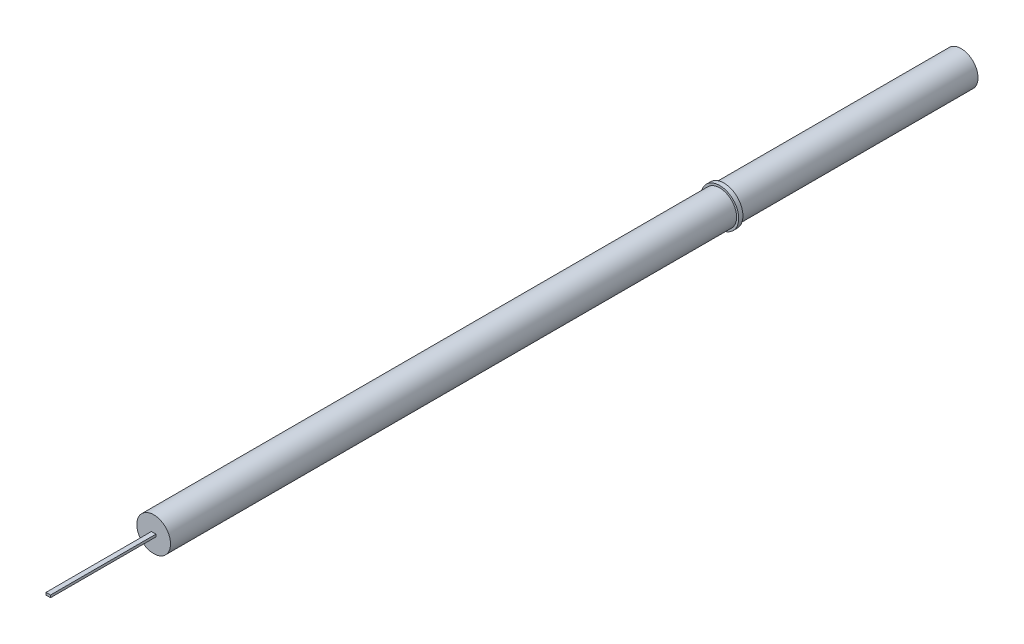
ISO-10303-21;
HEADER;
FILE_DESCRIPTION(('STEP AP214'),'2;1');
FILE_NAME('part.step','',(''),(''),'','','');
FILE_SCHEMA(('AUTOMOTIVE_DESIGN { 1 0 10303 214 1 1 1 1 }'));
ENDSEC;
DATA;
#1=APPLICATION_CONTEXT('core data for automotive mechanical design processes');
#2=APPLICATION_PROTOCOL_DEFINITION('international standard','automotive_design',2000,#1);
#3=PRODUCT_CONTEXT('',#1,'mechanical');
#4=PRODUCT('Part','Part','',(#3));
#5=PRODUCT_RELATED_PRODUCT_CATEGORY('part','',(#4));
#6=PRODUCT_DEFINITION_FORMATION('','',#4);
#7=PRODUCT_DEFINITION_CONTEXT('part definition',#1,'design');
#8=PRODUCT_DEFINITION('design','',#6,#7);
#9=PRODUCT_DEFINITION_SHAPE('','',#8);
#10=(LENGTH_UNIT() NAMED_UNIT(*) SI_UNIT(.MILLI.,.METRE.));
#11=(NAMED_UNIT(*) PLANE_ANGLE_UNIT() SI_UNIT($,.RADIAN.));
#12=(NAMED_UNIT(*) SI_UNIT($,.STERADIAN.) SOLID_ANGLE_UNIT());
#13=UNCERTAINTY_MEASURE_WITH_UNIT(LENGTH_MEASURE(1.E-05),#10,'distance_accuracy_value','');
#14=(GEOMETRIC_REPRESENTATION_CONTEXT(3) GLOBAL_UNCERTAINTY_ASSIGNED_CONTEXT((#13)) GLOBAL_UNIT_ASSIGNED_CONTEXT((#10,
#11,#12)) REPRESENTATION_CONTEXT('',''));
#15=CARTESIAN_POINT('',(0.,0.,0.));
#16=DIRECTION('',(0.,0.,1.));
#17=DIRECTION('',(1.,0.,0.));
#18=AXIS2_PLACEMENT_3D('',#15,#16,#17);
#19=CARTESIAN_POINT('',(0.,0.,38.3));
#20=DIRECTION('',(0.,0.,-1.));
#21=DIRECTION('',(-1.,0.,0.));
#22=AXIS2_PLACEMENT_3D('',#19,#20,#21);
#23=CYLINDRICAL_SURFACE('',#22,0.8);
#24=CARTESIAN_POINT('',(0.,0.,11.25));
#25=DIRECTION('',(0.,0.,-1.));
#26=DIRECTION('',(-1.,0.,0.));
#27=AXIS2_PLACEMENT_3D('',#24,#25,#26);
#28=CIRCLE('',#27,0.8);
#29=CARTESIAN_POINT('',(-0.8,0.,11.25));
#30=VERTEX_POINT('',#29);
#31=EDGE_CURVE('E37',#30,#30,#28,.T.);
#32=ORIENTED_EDGE('',*,*,#31,.T.);
#33=EDGE_LOOP('',(#32));
#34=FACE_BOUND('',#33,.T.);
#35=CARTESIAN_POINT('',(0.,0.,0.));
#36=DIRECTION('',(0.,0.,1.));
#37=DIRECTION('',(1.,0.,0.));
#38=AXIS2_PLACEMENT_3D('',#35,#36,#37);
#39=CIRCLE('',#38,0.8);
#40=CARTESIAN_POINT('',(0.8,0.,0.));
#41=VERTEX_POINT('',#40);
#42=EDGE_CURVE('E114',#41,#41,#39,.T.);
#43=ORIENTED_EDGE('',*,*,#42,.T.);
#44=EDGE_LOOP('',(#43));
#45=FACE_BOUND('',#44,.T.);
#46=ADVANCED_FACE('F34',(#34,#45),#23,.T.);
#47=CARTESIAN_POINT('',(0.,0.,0.));
#48=DIRECTION('',(0.,0.,1.));
#49=DIRECTION('',(1.,0.,0.));
#50=AXIS2_PLACEMENT_3D('',#47,#48,#49);
#51=PLANE('',#50);
#52=CARTESIAN_POINT('',(0.,0.,0.));
#53=DIRECTION('',(0.,0.,-1.));
#54=DIRECTION('',(-1.,0.,0.));
#55=AXIS2_PLACEMENT_3D('',#52,#53,#54);
#56=CIRCLE('',#55,0.75);
#57=CARTESIAN_POINT('',(-0.75,0.,0.));
#58=VERTEX_POINT('',#57);
#59=EDGE_CURVE('E95',#58,#58,#56,.T.);
#60=ORIENTED_EDGE('',*,*,#59,.F.);
#61=EDGE_LOOP('',(#60));
#62=FACE_BOUND('',#61,.T.);
#63=ORIENTED_EDGE('',*,*,#42,.F.);
#64=EDGE_LOOP('',(#63));
#65=FACE_BOUND('',#64,.T.);
#66=ADVANCED_FACE('F132',(#62,#65),#51,.F.);
#67=CARTESIAN_POINT('',(0.,0.,11.25));
#68=DIRECTION('',(0.,0.,1.));
#69=DIRECTION('',(1.,0.,0.));
#70=AXIS2_PLACEMENT_3D('',#67,#68,#69);
#71=CYLINDRICAL_SURFACE('',#70,0.9);
#72=CARTESIAN_POINT('',(0.,0.,11.25));
#73=DIRECTION('',(0.,0.,-1.));
#74=DIRECTION('',(-1.,0.,0.));
#75=AXIS2_PLACEMENT_3D('',#72,#73,#74);
#76=CIRCLE('',#75,0.9);
#77=CARTESIAN_POINT('',(-0.9,0.,11.25));
#78=VERTEX_POINT('',#77);
#79=EDGE_CURVE('E107',#78,#78,#76,.T.);
#80=ORIENTED_EDGE('',*,*,#79,.F.);
#81=EDGE_LOOP('',(#80));
#82=FACE_BOUND('',#81,.T.);
#83=CARTESIAN_POINT('',(0.,0.,11.45));
#84=DIRECTION('',(0.,0.,-1.));
#85=DIRECTION('',(-1.,0.,0.));
#86=AXIS2_PLACEMENT_3D('',#83,#84,#85);
#87=CIRCLE('',#86,0.9);
#88=CARTESIAN_POINT('',(-0.9,0.,11.45));
#89=VERTEX_POINT('',#88);
#90=EDGE_CURVE('E105',#89,#89,#87,.T.);
#91=ORIENTED_EDGE('',*,*,#90,.T.);
#92=EDGE_LOOP('',(#91));
#93=FACE_BOUND('',#92,.T.);
#94=ADVANCED_FACE('F126',(#82,#93),#71,.T.);
#95=CARTESIAN_POINT('',(0.,0.,11.25));
#96=DIRECTION('',(0.,0.,-1.));
#97=DIRECTION('',(-1.,0.,0.));
#98=AXIS2_PLACEMENT_3D('',#95,#96,#97);
#99=PLANE('',#98);
#100=ORIENTED_EDGE('',*,*,#31,.F.);
#101=EDGE_LOOP('',(#100));
#102=FACE_BOUND('',#101,.T.);
#103=ORIENTED_EDGE('',*,*,#79,.T.);
#104=EDGE_LOOP('',(#103));
#105=FACE_BOUND('',#104,.T.);
#106=ADVANCED_FACE('F122',(#102,#105),#99,.T.);
#107=CARTESIAN_POINT('',(0.,0.,11.45));
#108=DIRECTION('',(0.,0.,-1.));
#109=DIRECTION('',(-1.,0.,0.));
#110=AXIS2_PLACEMENT_3D('',#107,#108,#109);
#111=PLANE('',#110);
#112=CARTESIAN_POINT('',(0.,0.,11.45));
#113=DIRECTION('',(0.,0.,-1.));
#114=DIRECTION('',(-1.,0.,0.));
#115=AXIS2_PLACEMENT_3D('',#112,#113,#114);
#116=CIRCLE('',#115,0.8);
#117=CARTESIAN_POINT('',(-0.8,0.,11.45));
#118=VERTEX_POINT('',#117);
#119=EDGE_CURVE('E11',#118,#118,#116,.T.);
#120=ORIENTED_EDGE('',*,*,#119,.T.);
#121=EDGE_LOOP('',(#120));
#122=FACE_BOUND('',#121,.T.);
#123=ORIENTED_EDGE('',*,*,#90,.F.);
#124=EDGE_LOOP('',(#123));
#125=FACE_BOUND('',#124,.T.);
#126=ADVANCED_FACE('F125',(#122,#125),#111,.F.);
#127=CARTESIAN_POINT('',(0.,0.,38.3));
#128=DIRECTION('',(0.,0.,1.));
#129=DIRECTION('',(1.,0.,0.));
#130=AXIS2_PLACEMENT_3D('',#127,#128,#129);
#131=PLANE('',#130);
#132=DIRECTION('',(0.,1.,0.));
#133=VECTOR('',#132,1.);
#134=CARTESIAN_POINT('',(0.107659992147625,-0.0569964664312292,38.3));
#135=LINE('',#134,#133);
#136=CARTESIAN_POINT('',(0.107659992147625,-0.0569964664312292,38.3));
#137=VERTEX_POINT('',#136);
#138=CARTESIAN_POINT('',(0.107659992147625,0.0569964664312292,38.3));
#139=VERTEX_POINT('',#138);
#140=EDGE_CURVE('E49',#137,#139,#135,.T.);
#141=ORIENTED_EDGE('',*,*,#140,.F.);
#142=DIRECTION('',(1.,0.,0.));
#143=VECTOR('',#142,1.);
#144=CARTESIAN_POINT('',(-0.107659992147625,-0.0569964664312292,38.3));
#145=LINE('',#144,#143);
#146=CARTESIAN_POINT('',(-0.107659992147625,-0.0569964664312292,38.3));
#147=VERTEX_POINT('',#146);
#148=EDGE_CURVE('E53',#147,#137,#145,.T.);
#149=ORIENTED_EDGE('',*,*,#148,.F.);
#150=DIRECTION('',(0.,-1.,0.));
#151=VECTOR('',#150,1.);
#152=CARTESIAN_POINT('',(-0.107659992147625,-0.0569964664312292,38.3));
#153=LINE('',#152,#151);
#154=CARTESIAN_POINT('',(-0.107659992147625,0.0569964664312292,38.3));
#155=VERTEX_POINT('',#154);
#156=EDGE_CURVE('E282',#155,#147,#153,.T.);
#157=ORIENTED_EDGE('',*,*,#156,.F.);
#158=DIRECTION('',(-1.,0.,0.));
#159=VECTOR('',#158,1.);
#160=CARTESIAN_POINT('',(-0.107659992147625,0.0569964664312292,38.3));
#161=LINE('',#160,#159);
#162=EDGE_CURVE('E288',#139,#155,#161,.T.);
#163=ORIENTED_EDGE('',*,*,#162,.F.);
#164=EDGE_LOOP('',(#141,#149,#157,#163));
#165=FACE_BOUND('',#164,.T.);
#166=CARTESIAN_POINT('',(0.,0.,38.3));
#167=DIRECTION('',(0.,0.,1.));
#168=DIRECTION('',(1.,0.,0.));
#169=AXIS2_PLACEMENT_3D('',#166,#167,#168);
#170=CIRCLE('',#169,0.8);
#171=CARTESIAN_POINT('',(0.8,0.,38.3));
#172=VERTEX_POINT('',#171);
#173=EDGE_CURVE('E42',#172,#172,#170,.T.);
#174=ORIENTED_EDGE('',*,*,#173,.T.);
#175=EDGE_LOOP('',(#174));
#176=FACE_BOUND('',#175,.T.);
#177=ADVANCED_FACE('F137',(#165,#176),#131,.T.);
#178=ORIENTED_EDGE('',*,*,#173,.F.);
#179=EDGE_LOOP('',(#178));
#180=FACE_BOUND('',#179,.T.);
#181=ORIENTED_EDGE('',*,*,#119,.F.);
#182=EDGE_LOOP('',(#181));
#183=FACE_BOUND('',#182,.T.);
#184=ADVANCED_FACE('F143',(#180,#183),#23,.T.);
#185=CARTESIAN_POINT('',(0.,0.,38.25));
#186=DIRECTION('',(0.,0.,-1.));
#187=DIRECTION('',(-1.,0.,0.));
#188=AXIS2_PLACEMENT_3D('',#185,#186,#187);
#189=CYLINDRICAL_SURFACE('',#188,0.75);
#190=CARTESIAN_POINT('',(0.,0.,38.25));
#191=DIRECTION('',(0.,0.,-1.));
#192=DIRECTION('',(-1.,0.,0.));
#193=AXIS2_PLACEMENT_3D('',#190,#191,#192);
#194=CIRCLE('',#193,0.75);
#195=CARTESIAN_POINT('',(-0.75,0.,38.25));
#196=VERTEX_POINT('',#195);
#197=EDGE_CURVE('E98',#196,#196,#194,.T.);
#198=ORIENTED_EDGE('',*,*,#197,.F.);
#199=EDGE_LOOP('',(#198));
#200=FACE_BOUND('',#199,.T.);
#201=ORIENTED_EDGE('',*,*,#59,.T.);
#202=EDGE_LOOP('',(#201));
#203=FACE_BOUND('',#202,.T.);
#204=ADVANCED_FACE('F151',(#200,#203),#189,.F.);
#205=CARTESIAN_POINT('',(0.,0.,38.25));
#206=DIRECTION('',(0.,0.,-1.));
#207=DIRECTION('',(-1.,0.,0.));
#208=AXIS2_PLACEMENT_3D('',#205,#206,#207);
#209=PLANE('',#208);
#210=ORIENTED_EDGE('',*,*,#197,.T.);
#211=EDGE_LOOP('',(#210));
#212=FACE_BOUND('',#211,.T.);
#213=ADVANCED_FACE('F156',(#212),#209,.T.);
#214=CARTESIAN_POINT('',(0.107659992147625,-0.0569964664312292,43.3));
#215=DIRECTION('',(-1.,0.,0.));
#216=DIRECTION('',(0.,0.,1.));
#217=AXIS2_PLACEMENT_3D('',#214,#215,#216);
#218=PLANE('',#217);
#219=ORIENTED_EDGE('',*,*,#140,.T.);
#220=DIRECTION('',(0.,0.,-1.));
#221=VECTOR('',#220,1.);
#222=CARTESIAN_POINT('',(0.107659992147625,0.0569964664312292,43.3));
#223=LINE('',#222,#221);
#224=CARTESIAN_POINT('',(0.107659992147625,0.0569964664312292,43.3));
#225=VERTEX_POINT('',#224);
#226=EDGE_CURVE('E78',#225,#139,#223,.T.);
#227=ORIENTED_EDGE('',*,*,#226,.F.);
#228=DIRECTION('',(0.,1.,0.));
#229=VECTOR('',#228,1.);
#230=CARTESIAN_POINT('',(0.107659992147625,-0.0569964664312292,43.3));
#231=LINE('',#230,#229);
#232=CARTESIAN_POINT('',(0.107659992147625,-0.0569964664312292,43.3));
#233=VERTEX_POINT('',#232);
#234=EDGE_CURVE('E84',#233,#225,#231,.T.);
#235=ORIENTED_EDGE('',*,*,#234,.F.);
#236=DIRECTION('',(0.,0.,-1.));
#237=VECTOR('',#236,1.);
#238=CARTESIAN_POINT('',(0.107659992147625,-0.0569964664312292,43.3));
#239=LINE('',#238,#237);
#240=EDGE_CURVE('E280',#233,#137,#239,.T.);
#241=ORIENTED_EDGE('',*,*,#240,.T.);
#242=EDGE_LOOP('',(#219,#227,#235,#241));
#243=FACE_BOUND('',#242,.T.);
#244=ADVANCED_FACE('F94',(#243),#218,.F.);
#245=CARTESIAN_POINT('',(-0.107659992147625,0.0569964664312292,43.3));
#246=DIRECTION('',(0.,-1.,0.));
#247=DIRECTION('',(0.,0.,-1.));
#248=AXIS2_PLACEMENT_3D('',#245,#246,#247);
#249=PLANE('',#248);
#250=ORIENTED_EDGE('',*,*,#162,.T.);
#251=DIRECTION('',(0.,0.,-1.));
#252=VECTOR('',#251,1.);
#253=CARTESIAN_POINT('',(-0.107659992147625,0.0569964664312292,43.3));
#254=LINE('',#253,#252);
#255=CARTESIAN_POINT('',(-0.107659992147625,0.0569964664312292,43.3));
#256=VERTEX_POINT('',#255);
#257=EDGE_CURVE('E80',#256,#155,#254,.T.);
#258=ORIENTED_EDGE('',*,*,#257,.F.);
#259=DIRECTION('',(-1.,0.,0.));
#260=VECTOR('',#259,1.);
#261=CARTESIAN_POINT('',(-0.107659992147625,0.0569964664312292,43.3));
#262=LINE('',#261,#260);
#263=EDGE_CURVE('E73',#225,#256,#262,.T.);
#264=ORIENTED_EDGE('',*,*,#263,.F.);
#265=ORIENTED_EDGE('',*,*,#226,.T.);
#266=EDGE_LOOP('',(#250,#258,#264,#265));
#267=FACE_BOUND('',#266,.T.);
#268=ADVANCED_FACE('F76',(#267),#249,.F.);
#269=CARTESIAN_POINT('',(-0.107659992147625,-0.0569964664312292,43.3));
#270=DIRECTION('',(1.,0.,0.));
#271=DIRECTION('',(0.,0.,-1.));
#272=AXIS2_PLACEMENT_3D('',#269,#270,#271);
#273=PLANE('',#272);
#274=ORIENTED_EDGE('',*,*,#156,.T.);
#275=DIRECTION('',(0.,0.,-1.));
#276=VECTOR('',#275,1.);
#277=CARTESIAN_POINT('',(-0.107659992147625,-0.0569964664312292,43.3));
#278=LINE('',#277,#276);
#279=CARTESIAN_POINT('',(-0.107659992147625,-0.0569964664312292,43.3));
#280=VERTEX_POINT('',#279);
#281=EDGE_CURVE('E100',#280,#147,#278,.T.);
#282=ORIENTED_EDGE('',*,*,#281,.F.);
#283=DIRECTION('',(0.,-1.,0.));
#284=VECTOR('',#283,1.);
#285=CARTESIAN_POINT('',(-0.107659992147625,-0.0569964664312292,43.3));
#286=LINE('',#285,#284);
#287=EDGE_CURVE('E83',#256,#280,#286,.T.);
#288=ORIENTED_EDGE('',*,*,#287,.F.);
#289=ORIENTED_EDGE('',*,*,#257,.T.);
#290=EDGE_LOOP('',(#274,#282,#288,#289));
#291=FACE_BOUND('',#290,.T.);
#292=ADVANCED_FACE('F175',(#291),#273,.F.);
#293=CARTESIAN_POINT('',(-0.107659992147625,-0.0569964664312292,43.3));
#294=DIRECTION('',(0.,1.,0.));
#295=DIRECTION('',(0.,0.,1.));
#296=AXIS2_PLACEMENT_3D('',#293,#294,#295);
#297=PLANE('',#296);
#298=ORIENTED_EDGE('',*,*,#148,.T.);
#299=ORIENTED_EDGE('',*,*,#240,.F.);
#300=DIRECTION('',(1.,0.,0.));
#301=VECTOR('',#300,1.);
#302=CARTESIAN_POINT('',(-0.107659992147625,-0.0569964664312292,43.3));
#303=LINE('',#302,#301);
#304=EDGE_CURVE('E89',#280,#233,#303,.T.);
#305=ORIENTED_EDGE('',*,*,#304,.F.);
#306=ORIENTED_EDGE('',*,*,#281,.T.);
#307=EDGE_LOOP('',(#298,#299,#305,#306));
#308=FACE_BOUND('',#307,.T.);
#309=ADVANCED_FACE('F178',(#308),#297,.F.);
#310=CARTESIAN_POINT('',(0.,0.,43.3));
#311=DIRECTION('',(0.,0.,-1.));
#312=DIRECTION('',(-1.,0.,0.));
#313=AXIS2_PLACEMENT_3D('',#310,#311,#312);
#314=PLANE('',#313);
#315=ORIENTED_EDGE('',*,*,#234,.T.);
#316=ORIENTED_EDGE('',*,*,#263,.T.);
#317=ORIENTED_EDGE('',*,*,#287,.T.);
#318=ORIENTED_EDGE('',*,*,#304,.T.);
#319=EDGE_LOOP('',(#315,#316,#317,#318));
#320=FACE_BOUND('',#319,.T.);
#321=ADVANCED_FACE('F87',(#320),#314,.F.);
#322=CLOSED_SHELL('',(#46,#66,#94,#106,#126,#177,#184,#204,#213,#244,#268,#292,#309,#321));
#323=MANIFOLD_SOLID_BREP('B2',#322);
#324=ADVANCED_BREP_SHAPE_REPRESENTATION('',(#18,#323),#14);
#325=SHAPE_DEFINITION_REPRESENTATION(#9,#324);
ENDSEC;
END-ISO-10303-21;
